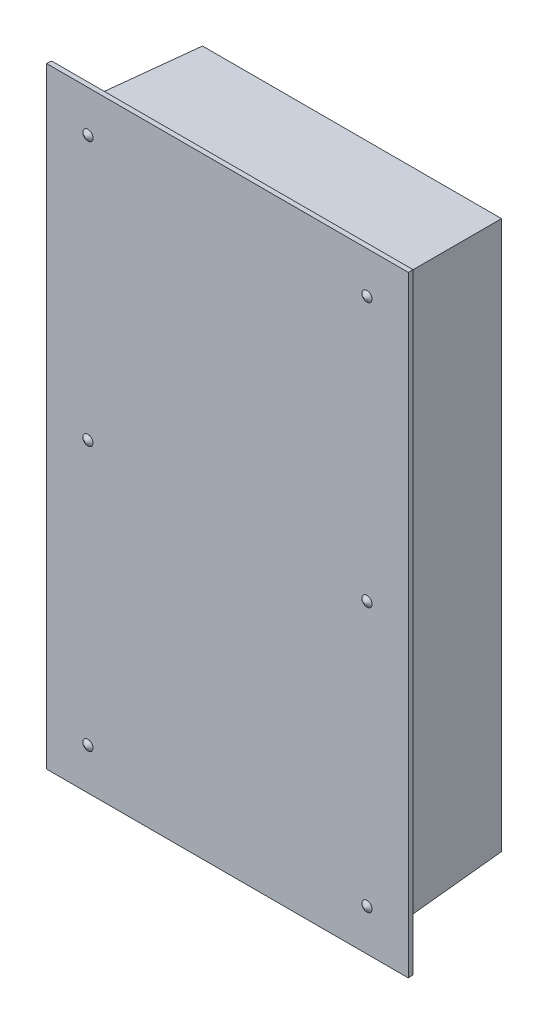
ISO-10303-21;
HEADER;
FILE_DESCRIPTION(('STEP AP214'),'2;1');
FILE_NAME('part.step','',(''),(''),'','','');
FILE_SCHEMA(('AUTOMOTIVE_DESIGN { 1 0 10303 214 1 1 1 1 }'));
ENDSEC;
DATA;
#1=APPLICATION_CONTEXT('core data for automotive mechanical design processes');
#2=APPLICATION_PROTOCOL_DEFINITION('international standard','automotive_design',2000,#1);
#3=PRODUCT_CONTEXT('',#1,'mechanical');
#4=PRODUCT('Part','Part','',(#3));
#5=PRODUCT_RELATED_PRODUCT_CATEGORY('part','',(#4));
#6=PRODUCT_DEFINITION_FORMATION('','',#4);
#7=PRODUCT_DEFINITION_CONTEXT('part definition',#1,'design');
#8=PRODUCT_DEFINITION('design','',#6,#7);
#9=PRODUCT_DEFINITION_SHAPE('','',#8);
#10=(LENGTH_UNIT() NAMED_UNIT(*) SI_UNIT(.MILLI.,.METRE.));
#11=(NAMED_UNIT(*) PLANE_ANGLE_UNIT() SI_UNIT($,.RADIAN.));
#12=(NAMED_UNIT(*) SI_UNIT($,.STERADIAN.) SOLID_ANGLE_UNIT());
#13=UNCERTAINTY_MEASURE_WITH_UNIT(LENGTH_MEASURE(1.E-05),#10,'distance_accuracy_value','');
#14=(GEOMETRIC_REPRESENTATION_CONTEXT(3) GLOBAL_UNCERTAINTY_ASSIGNED_CONTEXT((#13)) GLOBAL_UNIT_ASSIGNED_CONTEXT((#10,
#11,#12)) REPRESENTATION_CONTEXT('',''));
#15=CARTESIAN_POINT('',(0.,0.,0.));
#16=DIRECTION('',(0.,0.,1.));
#17=DIRECTION('',(1.,0.,0.));
#18=AXIS2_PLACEMENT_3D('',#15,#16,#17);
#19=CARTESIAN_POINT('',(0.,0.,0.));
#20=DIRECTION('',(0.,0.,-1.));
#21=DIRECTION('',(-1.,0.,0.));
#22=AXIS2_PLACEMENT_3D('',#19,#20,#21);
#23=PLANE('',#22);
#24=CARTESIAN_POINT('',(56.,106.,0.));
#25=DIRECTION('',(0.,0.,-1.));
#26=DIRECTION('',(-1.,0.,0.));
#27=AXIS2_PLACEMENT_3D('',#24,#25,#26);
#28=CIRCLE('',#27,1.49999999999999);
#29=CARTESIAN_POINT('',(54.5,106.,0.));
#30=VERTEX_POINT('',#29);
#31=EDGE_CURVE('E287',#30,#30,#28,.T.);
#32=ORIENTED_EDGE('',*,*,#31,.F.);
#33=EDGE_LOOP('',(#32));
#34=FACE_BOUND('',#33,.T.);
#35=CARTESIAN_POINT('',(-56.,106.,0.));
#36=DIRECTION('',(0.,0.,-1.));
#37=DIRECTION('',(-1.,0.,0.));
#38=AXIS2_PLACEMENT_3D('',#35,#36,#37);
#39=CIRCLE('',#38,1.49999999999999);
#40=CARTESIAN_POINT('',(-57.5,106.,0.));
#41=VERTEX_POINT('',#40);
#42=EDGE_CURVE('E293',#41,#41,#39,.T.);
#43=ORIENTED_EDGE('',*,*,#42,.F.);
#44=EDGE_LOOP('',(#43));
#45=FACE_BOUND('',#44,.T.);
#46=CARTESIAN_POINT('',(56.,-106.,0.));
#47=DIRECTION('',(0.,0.,-1.));
#48=DIRECTION('',(-1.,0.,0.));
#49=AXIS2_PLACEMENT_3D('',#46,#47,#48);
#50=CIRCLE('',#49,1.49999999999999);
#51=CARTESIAN_POINT('',(54.5,-106.,0.));
#52=VERTEX_POINT('',#51);
#53=EDGE_CURVE('E299',#52,#52,#50,.T.);
#54=ORIENTED_EDGE('',*,*,#53,.F.);
#55=EDGE_LOOP('',(#54));
#56=FACE_BOUND('',#55,.T.);
#57=CARTESIAN_POINT('',(-56.,-106.,0.));
#58=DIRECTION('',(0.,0.,-1.));
#59=DIRECTION('',(-1.,0.,0.));
#60=AXIS2_PLACEMENT_3D('',#57,#58,#59);
#61=CIRCLE('',#60,1.49999999999999);
#62=CARTESIAN_POINT('',(-57.5,-106.,0.));
#63=VERTEX_POINT('',#62);
#64=EDGE_CURVE('E305',#63,#63,#61,.T.);
#65=ORIENTED_EDGE('',*,*,#64,.F.);
#66=EDGE_LOOP('',(#65));
#67=FACE_BOUND('',#66,.T.);
#68=CARTESIAN_POINT('',(56.,0.,0.));
#69=DIRECTION('',(0.,0.,-1.));
#70=DIRECTION('',(-1.,0.,0.));
#71=AXIS2_PLACEMENT_3D('',#68,#69,#70);
#72=CIRCLE('',#71,1.49999999999999);
#73=CARTESIAN_POINT('',(54.5,0.,0.));
#74=VERTEX_POINT('',#73);
#75=EDGE_CURVE('E311',#74,#74,#72,.T.);
#76=ORIENTED_EDGE('',*,*,#75,.F.);
#77=EDGE_LOOP('',(#76));
#78=FACE_BOUND('',#77,.T.);
#79=CARTESIAN_POINT('',(-56.,0.,0.));
#80=DIRECTION('',(0.,0.,-1.));
#81=DIRECTION('',(-1.,0.,0.));
#82=AXIS2_PLACEMENT_3D('',#79,#80,#81);
#83=CIRCLE('',#82,1.49999999999999);
#84=CARTESIAN_POINT('',(-57.5,0.,0.));
#85=VERTEX_POINT('',#84);
#86=EDGE_CURVE('E317',#85,#85,#83,.T.);
#87=ORIENTED_EDGE('',*,*,#86,.F.);
#88=EDGE_LOOP('',(#87));
#89=FACE_BOUND('',#88,.T.);
#90=DIRECTION('',(0.,1.,0.));
#91=VECTOR('',#90,1.);
#92=CARTESIAN_POINT('',(60.,-110.,0.));
#93=LINE('',#92,#91);
#94=CARTESIAN_POINT('',(60.,-110.,0.));
#95=VERTEX_POINT('',#94);
#96=CARTESIAN_POINT('',(60.,110.,0.));
#97=VERTEX_POINT('',#96);
#98=EDGE_CURVE('E336',#95,#97,#93,.T.);
#99=ORIENTED_EDGE('',*,*,#98,.F.);
#100=DIRECTION('',(1.,0.,0.));
#101=VECTOR('',#100,1.);
#102=CARTESIAN_POINT('',(-60.,-110.,0.));
#103=LINE('',#102,#101);
#104=CARTESIAN_POINT('',(-60.,-110.,0.));
#105=VERTEX_POINT('',#104);
#106=EDGE_CURVE('E360',#105,#95,#103,.T.);
#107=ORIENTED_EDGE('',*,*,#106,.F.);
#108=DIRECTION('',(0.,-1.,0.));
#109=VECTOR('',#108,1.);
#110=CARTESIAN_POINT('',(-60.,-110.,0.));
#111=LINE('',#110,#109);
#112=CARTESIAN_POINT('',(-60.,110.,0.));
#113=VERTEX_POINT('',#112);
#114=EDGE_CURVE('E358',#113,#105,#111,.T.);
#115=ORIENTED_EDGE('',*,*,#114,.F.);
#116=DIRECTION('',(-1.,0.,0.));
#117=VECTOR('',#116,1.);
#118=CARTESIAN_POINT('',(-60.,110.,0.));
#119=LINE('',#118,#117);
#120=EDGE_CURVE('E356',#97,#113,#119,.T.);
#121=ORIENTED_EDGE('',*,*,#120,.F.);
#122=EDGE_LOOP('',(#99,#107,#115,#121));
#123=FACE_BOUND('',#122,.T.);
#124=CARTESIAN_POINT('',(-56.,-106.,0.));
#125=DIRECTION('',(0.,0.,-1.));
#126=DIRECTION('',(-1.,0.,0.));
#127=AXIS2_PLACEMENT_3D('',#124,#125,#126);
#128=CIRCLE('',#127,3.49999999999999);
#129=CARTESIAN_POINT('',(-57.9972553080042,-103.125809464449,0.));
#130=VERTEX_POINT('',#129);
#131=CARTESIAN_POINT('',(-53.1258094644493,-107.997255308004,0.));
#132=VERTEX_POINT('',#131);
#133=EDGE_CURVE('E228',#130,#132,#128,.T.);
#134=ORIENTED_EDGE('',*,*,#133,.T.);
#135=DIRECTION('',(-1.,0.,0.));
#136=VECTOR('',#135,1.);
#137=CARTESIAN_POINT('',(0.,-107.997255308004,0.));
#138=LINE('',#137,#136);
#139=CARTESIAN_POINT('',(53.1258094644493,-107.997255308004,0.));
#140=VERTEX_POINT('',#139);
#141=EDGE_CURVE('E558',#132,#140,#138,.F.);
#142=ORIENTED_EDGE('',*,*,#141,.T.);
#143=CARTESIAN_POINT('',(56.,-106.,0.));
#144=DIRECTION('',(0.,0.,-1.));
#145=DIRECTION('',(-1.,0.,0.));
#146=AXIS2_PLACEMENT_3D('',#143,#144,#145);
#147=CIRCLE('',#146,3.49999999999999);
#148=CARTESIAN_POINT('',(57.9972553080041,-103.125809464449,0.));
#149=VERTEX_POINT('',#148);
#150=EDGE_CURVE('E223',#140,#149,#147,.T.);
#151=ORIENTED_EDGE('',*,*,#150,.T.);
#152=DIRECTION('',(0.,-1.,0.));
#153=VECTOR('',#152,1.);
#154=CARTESIAN_POINT('',(57.9972553080041,0.,0.));
#155=LINE('',#154,#153);
#156=CARTESIAN_POINT('',(57.9972553080041,-2.87419053555069,0.));
#157=VERTEX_POINT('',#156);
#158=EDGE_CURVE('E54',#149,#157,#155,.F.);
#159=ORIENTED_EDGE('',*,*,#158,.T.);
#160=CARTESIAN_POINT('',(56.,0.,0.));
#161=DIRECTION('',(0.,0.,-1.));
#162=DIRECTION('',(-1.,0.,0.));
#163=AXIS2_PLACEMENT_3D('',#160,#161,#162);
#164=CIRCLE('',#163,3.49999999999999);
#165=CARTESIAN_POINT('',(57.9972553080041,2.87419053555069,0.));
#166=VERTEX_POINT('',#165);
#167=EDGE_CURVE('E234',#157,#166,#164,.T.);
#168=ORIENTED_EDGE('',*,*,#167,.T.);
#169=CARTESIAN_POINT('',(57.9972553080041,103.125809464449,0.));
#170=VERTEX_POINT('',#169);
#171=EDGE_CURVE('E551',#166,#170,#155,.F.);
#172=ORIENTED_EDGE('',*,*,#171,.T.);
#173=CARTESIAN_POINT('',(56.,106.,0.));
#174=DIRECTION('',(0.,0.,-1.));
#175=DIRECTION('',(-1.,0.,0.));
#176=AXIS2_PLACEMENT_3D('',#173,#174,#175);
#177=CIRCLE('',#176,3.49999999999999);
#178=CARTESIAN_POINT('',(53.1258094644493,107.997255308004,0.));
#179=VERTEX_POINT('',#178);
#180=EDGE_CURVE('E211',#170,#179,#177,.T.);
#181=ORIENTED_EDGE('',*,*,#180,.T.);
#182=DIRECTION('',(1.,0.,0.));
#183=VECTOR('',#182,1.);
#184=CARTESIAN_POINT('',(0.,107.997255308004,0.));
#185=LINE('',#184,#183);
#186=CARTESIAN_POINT('',(-53.1258094644493,107.997255308004,0.));
#187=VERTEX_POINT('',#186);
#188=EDGE_CURVE('E219',#179,#187,#185,.F.);
#189=ORIENTED_EDGE('',*,*,#188,.T.);
#190=CARTESIAN_POINT('',(-56.,106.,0.));
#191=DIRECTION('',(0.,0.,-1.));
#192=DIRECTION('',(-1.,0.,0.));
#193=AXIS2_PLACEMENT_3D('',#190,#191,#192);
#194=CIRCLE('',#193,3.49999999999999);
#195=CARTESIAN_POINT('',(-57.9972553080042,103.125809464449,0.));
#196=VERTEX_POINT('',#195);
#197=EDGE_CURVE('E210',#187,#196,#194,.T.);
#198=ORIENTED_EDGE('',*,*,#197,.T.);
#199=DIRECTION('',(0.,1.,0.));
#200=VECTOR('',#199,1.);
#201=CARTESIAN_POINT('',(-57.9972553080042,0.,0.));
#202=LINE('',#201,#200);
#203=CARTESIAN_POINT('',(-57.9972553080042,2.87419053555069,0.));
#204=VERTEX_POINT('',#203);
#205=EDGE_CURVE('E550',#196,#204,#202,.F.);
#206=ORIENTED_EDGE('',*,*,#205,.T.);
#207=CARTESIAN_POINT('',(-56.,0.,0.));
#208=DIRECTION('',(0.,0.,-1.));
#209=DIRECTION('',(-1.,0.,0.));
#210=AXIS2_PLACEMENT_3D('',#207,#208,#209);
#211=CIRCLE('',#210,3.49999999999999);
#212=CARTESIAN_POINT('',(-57.9972553080042,-2.87419053555069,0.));
#213=VERTEX_POINT('',#212);
#214=EDGE_CURVE('E240',#204,#213,#211,.T.);
#215=ORIENTED_EDGE('',*,*,#214,.T.);
#216=EDGE_CURVE('E561',#213,#130,#202,.F.);
#217=ORIENTED_EDGE('',*,*,#216,.T.);
#218=EDGE_LOOP('',(#134,#142,#151,#159,#168,#172,#181,#189,#198,#206,#215,#217));
#219=FACE_BOUND('',#218,.T.);
#220=ADVANCED_FACE('F37',(#34,#45,#56,#67,#78,#89,#123,#219),#23,.T.);
#221=CARTESIAN_POINT('',(60.,-110.,0.));
#222=DIRECTION('',(0.998629534754574,0.,-0.0523359562429439));
#223=DIRECTION('',(-0.0523359562429439,0.,-0.998629534754574));
#224=AXIS2_PLACEMENT_3D('',#221,#222,#223);
#225=PLANE('',#224);
#226=ORIENTED_EDGE('',*,*,#98,.T.);
#227=DIRECTION('',(-0.052264427688714,-0.052264427688714,-0.997264688634237));
#228=VECTOR('',#227,1.);
#229=CARTESIAN_POINT('',(59.6722115518045,109.672211551805,-6.25457618467583));
#230=LINE('',#229,#228);
#231=CARTESIAN_POINT('',(62.515573405586,112.515573405586,48.));
#232=VERTEX_POINT('',#231);
#233=EDGE_CURVE('E11',#232,#97,#230,.T.);
#234=ORIENTED_EDGE('',*,*,#233,.F.);
#235=DIRECTION('',(0.,-1.,0.));
#236=VECTOR('',#235,1.);
#237=CARTESIAN_POINT('',(62.5155734055859,0.,48.));
#238=LINE('',#237,#236);
#239=CARTESIAN_POINT('',(62.515573405586,-112.515573405586,48.));
#240=VERTEX_POINT('',#239);
#241=EDGE_CURVE('E361',#240,#232,#238,.F.);
#242=ORIENTED_EDGE('',*,*,#241,.F.);
#243=DIRECTION('',(-0.052264427688714,0.052264427688714,-0.997264688634237));
#244=VECTOR('',#243,1.);
#245=CARTESIAN_POINT('',(60.,-110.,0.));
#246=LINE('',#245,#244);
#247=EDGE_CURVE('E363',#240,#95,#246,.T.);
#248=ORIENTED_EDGE('',*,*,#247,.T.);
#249=EDGE_LOOP('',(#226,#234,#242,#248));
#250=FACE_BOUND('',#249,.T.);
#251=ADVANCED_FACE('F384',(#250),#225,.T.);
#252=CARTESIAN_POINT('',(-60.,110.,0.));
#253=DIRECTION('',(0.,0.998629534754574,-0.0523359562429439));
#254=DIRECTION('',(0.,0.0523359562429439,0.998629534754574));
#255=AXIS2_PLACEMENT_3D('',#252,#253,#254);
#256=PLANE('',#255);
#257=ORIENTED_EDGE('',*,*,#120,.T.);
#258=DIRECTION('',(0.052264427688714,-0.052264427688714,-0.997264688634237));
#259=VECTOR('',#258,1.);
#260=CARTESIAN_POINT('',(-59.3990545116417,109.399054511642,-11.466723005239));
#261=LINE('',#260,#259);
#262=CARTESIAN_POINT('',(-62.515573405586,112.515573405586,48.));
#263=VERTEX_POINT('',#262);
#264=EDGE_CURVE('E46',#263,#113,#261,.T.);
#265=ORIENTED_EDGE('',*,*,#264,.F.);
#266=DIRECTION('',(1.,0.,0.));
#267=VECTOR('',#266,1.);
#268=CARTESIAN_POINT('',(0.,112.515573405586,48.));
#269=LINE('',#268,#267);
#270=EDGE_CURVE('E371',#232,#263,#269,.F.);
#271=ORIENTED_EDGE('',*,*,#270,.F.);
#272=ORIENTED_EDGE('',*,*,#233,.T.);
#273=EDGE_LOOP('',(#257,#265,#271,#272));
#274=FACE_BOUND('',#273,.T.);
#275=ADVANCED_FACE('F39',(#274),#256,.T.);
#276=CARTESIAN_POINT('',(-60.,-110.,0.));
#277=DIRECTION('',(-0.998629534754574,0.,-0.0523359562429439));
#278=DIRECTION('',(-0.0523359562429439,0.,0.998629534754574));
#279=AXIS2_PLACEMENT_3D('',#276,#277,#278);
#280=PLANE('',#279);
#281=ORIENTED_EDGE('',*,*,#114,.T.);
#282=DIRECTION('',(0.052264427688714,0.052264427688714,-0.997264688634237));
#283=VECTOR('',#282,1.);
#284=CARTESIAN_POINT('',(-60.,-110.,0.));
#285=LINE('',#284,#283);
#286=CARTESIAN_POINT('',(-62.515573405586,-112.515573405586,48.));
#287=VERTEX_POINT('',#286);
#288=EDGE_CURVE('E62',#287,#105,#285,.T.);
#289=ORIENTED_EDGE('',*,*,#288,.F.);
#290=DIRECTION('',(0.,1.,0.));
#291=VECTOR('',#290,1.);
#292=CARTESIAN_POINT('',(-62.515573405586,0.,48.));
#293=LINE('',#292,#291);
#294=EDGE_CURVE('E373',#263,#287,#293,.F.);
#295=ORIENTED_EDGE('',*,*,#294,.F.);
#296=ORIENTED_EDGE('',*,*,#264,.T.);
#297=EDGE_LOOP('',(#281,#289,#295,#296));
#298=FACE_BOUND('',#297,.T.);
#299=ADVANCED_FACE('F390',(#298),#280,.T.);
#300=CARTESIAN_POINT('',(-60.,-110.,0.));
#301=DIRECTION('',(0.,-0.998629534754574,-0.0523359562429439));
#302=DIRECTION('',(0.,0.0523359562429439,-0.998629534754574));
#303=AXIS2_PLACEMENT_3D('',#300,#301,#302);
#304=PLANE('',#303);
#305=ORIENTED_EDGE('',*,*,#106,.T.);
#306=ORIENTED_EDGE('',*,*,#247,.F.);
#307=DIRECTION('',(-1.,0.,0.));
#308=VECTOR('',#307,1.);
#309=CARTESIAN_POINT('',(0.,-112.515573405586,48.));
#310=LINE('',#309,#308);
#311=EDGE_CURVE('E41',#287,#240,#310,.F.);
#312=ORIENTED_EDGE('',*,*,#311,.F.);
#313=ORIENTED_EDGE('',*,*,#288,.T.);
#314=EDGE_LOOP('',(#305,#306,#312,#313));
#315=FACE_BOUND('',#314,.T.);
#316=ADVANCED_FACE('F380',(#315),#304,.T.);
#317=CARTESIAN_POINT('',(0.,0.,48.));
#318=DIRECTION('',(0.,0.,1.));
#319=DIRECTION('',(1.,0.,0.));
#320=AXIS2_PLACEMENT_3D('',#317,#318,#319);
#321=PLANE('',#320);
#322=DIRECTION('',(0.,1.,0.));
#323=VECTOR('',#322,1.);
#324=CARTESIAN_POINT('',(72.515573405586,122.515573405586,48.));
#325=LINE('',#324,#323);
#326=CARTESIAN_POINT('',(72.515573405586,-122.515573405586,48.));
#327=VERTEX_POINT('',#326);
#328=CARTESIAN_POINT('',(72.515573405586,122.515573405586,48.));
#329=VERTEX_POINT('',#328);
#330=EDGE_CURVE('E323',#327,#329,#325,.T.);
#331=ORIENTED_EDGE('',*,*,#330,.F.);
#332=DIRECTION('',(1.,0.,0.));
#333=VECTOR('',#332,1.);
#334=CARTESIAN_POINT('',(-72.5155734055859,-122.515573405586,48.));
#335=LINE('',#334,#333);
#336=CARTESIAN_POINT('',(-72.5155734055859,-122.515573405586,48.));
#337=VERTEX_POINT('',#336);
#338=EDGE_CURVE('E330',#337,#327,#335,.T.);
#339=ORIENTED_EDGE('',*,*,#338,.F.);
#340=DIRECTION('',(0.,-1.,0.));
#341=VECTOR('',#340,1.);
#342=CARTESIAN_POINT('',(-72.5155734055859,122.515573405586,48.));
#343=LINE('',#342,#341);
#344=CARTESIAN_POINT('',(-72.5155734055859,122.515573405586,48.));
#345=VERTEX_POINT('',#344);
#346=EDGE_CURVE('E328',#345,#337,#343,.T.);
#347=ORIENTED_EDGE('',*,*,#346,.F.);
#348=DIRECTION('',(-1.,0.,0.));
#349=VECTOR('',#348,1.);
#350=CARTESIAN_POINT('',(-72.5155734055859,122.515573405586,48.));
#351=LINE('',#350,#349);
#352=EDGE_CURVE('E326',#329,#345,#351,.T.);
#353=ORIENTED_EDGE('',*,*,#352,.F.);
#354=EDGE_LOOP('',(#331,#339,#347,#353));
#355=FACE_BOUND('',#354,.T.);
#356=ORIENTED_EDGE('',*,*,#311,.T.);
#357=ORIENTED_EDGE('',*,*,#241,.T.);
#358=ORIENTED_EDGE('',*,*,#270,.T.);
#359=ORIENTED_EDGE('',*,*,#294,.T.);
#360=EDGE_LOOP('',(#356,#357,#358,#359));
#361=FACE_BOUND('',#360,.T.);
#362=ADVANCED_FACE('F377',(#355,#361),#321,.F.);
#363=CARTESIAN_POINT('',(72.515573405586,122.515573405586,48.));
#364=DIRECTION('',(0.998629534754574,0.,-0.0523359562429439));
#365=DIRECTION('',(-0.0523359562429439,0.,-0.998629534754574));
#366=AXIS2_PLACEMENT_3D('',#363,#364,#365);
#367=PLANE('',#366);
#368=ORIENTED_EDGE('',*,*,#330,.T.);
#369=DIRECTION('',(-0.052264427688714,-0.052264427688714,-0.997264688634237));
#370=VECTOR('',#369,1.);
#371=CARTESIAN_POINT('',(72.1194106176423,122.119410617642,40.4407636926552));
#372=LINE('',#371,#370);
#373=CARTESIAN_POINT('',(72.620388964152,122.620388964152,50.));
#374=VERTEX_POINT('',#373);
#375=EDGE_CURVE('E333',#374,#329,#372,.T.);
#376=ORIENTED_EDGE('',*,*,#375,.F.);
#377=DIRECTION('',(0.,-1.,0.));
#378=VECTOR('',#377,1.);
#379=CARTESIAN_POINT('',(72.620388964152,122.515573405586,50.));
#380=LINE('',#379,#378);
#381=CARTESIAN_POINT('',(72.620388964152,-122.620388964152,50.));
#382=VERTEX_POINT('',#381);
#383=EDGE_CURVE('E332',#382,#374,#380,.F.);
#384=ORIENTED_EDGE('',*,*,#383,.F.);
#385=DIRECTION('',(-0.052264427688714,0.052264427688714,-0.997264688634237));
#386=VECTOR('',#385,1.);
#387=CARTESIAN_POINT('',(71.8462535774794,-121.846253577479,35.228616872092));
#388=LINE('',#387,#386);
#389=EDGE_CURVE('E338',#382,#327,#388,.T.);
#390=ORIENTED_EDGE('',*,*,#389,.T.);
#391=EDGE_LOOP('',(#368,#376,#384,#390));
#392=FACE_BOUND('',#391,.T.);
#393=ADVANCED_FACE('F411',(#392),#367,.T.);
#394=CARTESIAN_POINT('',(-72.5155734055859,122.515573405586,48.));
#395=DIRECTION('',(0.,0.998629534754574,-0.0523359562429439));
#396=DIRECTION('',(0.,0.0523359562429439,0.998629534754574));
#397=AXIS2_PLACEMENT_3D('',#394,#395,#396);
#398=PLANE('',#397);
#399=ORIENTED_EDGE('',*,*,#352,.T.);
#400=DIRECTION('',(0.052264427688714,-0.052264427688714,-0.997264688634237));
#401=VECTOR('',#400,1.);
#402=CARTESIAN_POINT('',(-72.5155734055859,122.515573405586,48.));
#403=LINE('',#402,#401);
#404=CARTESIAN_POINT('',(-72.620388964152,122.620388964152,50.));
#405=VERTEX_POINT('',#404);
#406=EDGE_CURVE('E337',#405,#345,#403,.T.);
#407=ORIENTED_EDGE('',*,*,#406,.F.);
#408=DIRECTION('',(1.,0.,0.));
#409=VECTOR('',#408,1.);
#410=CARTESIAN_POINT('',(-72.5155734055859,122.620388964152,50.));
#411=LINE('',#410,#409);
#412=EDGE_CURVE('E349',#374,#405,#411,.F.);
#413=ORIENTED_EDGE('',*,*,#412,.F.);
#414=ORIENTED_EDGE('',*,*,#375,.T.);
#415=EDGE_LOOP('',(#399,#407,#413,#414));
#416=FACE_BOUND('',#415,.T.);
#417=ADVANCED_FACE('F407',(#416),#398,.T.);
#418=CARTESIAN_POINT('',(-72.5155734055859,122.515573405586,48.));
#419=DIRECTION('',(-0.998629534754574,0.,-0.0523359562429439));
#420=DIRECTION('',(-0.0523359562429439,0.,0.998629534754574));
#421=AXIS2_PLACEMENT_3D('',#418,#419,#420);
#422=PLANE('',#421);
#423=ORIENTED_EDGE('',*,*,#346,.T.);
#424=DIRECTION('',(0.052264427688714,0.052264427688714,-0.997264688634237));
#425=VECTOR('',#424,1.);
#426=CARTESIAN_POINT('',(-72.5155734055859,-122.515573405586,48.));
#427=LINE('',#426,#425);
#428=CARTESIAN_POINT('',(-72.620388964152,-122.620388964152,50.));
#429=VERTEX_POINT('',#428);
#430=EDGE_CURVE('E341',#429,#337,#427,.T.);
#431=ORIENTED_EDGE('',*,*,#430,.F.);
#432=DIRECTION('',(0.,1.,0.));
#433=VECTOR('',#432,1.);
#434=CARTESIAN_POINT('',(-72.620388964152,122.515573405586,50.));
#435=LINE('',#434,#433);
#436=EDGE_CURVE('E351',#405,#429,#435,.F.);
#437=ORIENTED_EDGE('',*,*,#436,.F.);
#438=ORIENTED_EDGE('',*,*,#406,.T.);
#439=EDGE_LOOP('',(#423,#431,#437,#438));
#440=FACE_BOUND('',#439,.T.);
#441=ADVANCED_FACE('F410',(#440),#422,.T.);
#442=CARTESIAN_POINT('',(-72.5155734055859,-122.515573405586,48.));
#443=DIRECTION('',(0.,-0.998629534754574,-0.0523359562429439));
#444=DIRECTION('',(0.,0.0523359562429439,-0.998629534754574));
#445=AXIS2_PLACEMENT_3D('',#442,#443,#444);
#446=PLANE('',#445);
#447=ORIENTED_EDGE('',*,*,#338,.T.);
#448=ORIENTED_EDGE('',*,*,#389,.F.);
#449=DIRECTION('',(-1.,0.,0.));
#450=VECTOR('',#449,1.);
#451=CARTESIAN_POINT('',(-72.5155734055859,-122.620388964152,50.));
#452=LINE('',#451,#450);
#453=EDGE_CURVE('E342',#429,#382,#452,.F.);
#454=ORIENTED_EDGE('',*,*,#453,.F.);
#455=ORIENTED_EDGE('',*,*,#430,.T.);
#456=EDGE_LOOP('',(#447,#448,#454,#455));
#457=FACE_BOUND('',#456,.T.);
#458=ADVANCED_FACE('F415',(#457),#446,.T.);
#459=CARTESIAN_POINT('',(0.,0.,50.));
#460=DIRECTION('',(0.,0.,1.));
#461=DIRECTION('',(1.,0.,0.));
#462=AXIS2_PLACEMENT_3D('',#459,#460,#461);
#463=PLANE('',#462);
#464=ORIENTED_EDGE('',*,*,#383,.T.);
#465=ORIENTED_EDGE('',*,*,#412,.T.);
#466=ORIENTED_EDGE('',*,*,#436,.T.);
#467=ORIENTED_EDGE('',*,*,#453,.T.);
#468=EDGE_LOOP('',(#464,#465,#466,#467));
#469=FACE_BOUND('',#468,.T.);
#470=ADVANCED_FACE('F419',(#469),#463,.T.);
#471=CARTESIAN_POINT('',(-56.,0.,48.));
#472=DIRECTION('',(0.,0.,-1.));
#473=DIRECTION('',(-1.,0.,0.));
#474=AXIS2_PLACEMENT_3D('',#471,#472,#473);
#475=CONICAL_SURFACE('',#474,1.49999999999999,1.02974425867665);
#476=CARTESIAN_POINT('',(-56.,0.,48.9012909285413));
#477=VERTEX_POINT('',#476);
#478=VERTEX_LOOP('',#477);
#479=FACE_BOUND('',#478,.T.);
#480=CARTESIAN_POINT('',(-56.,0.,48.));
#481=DIRECTION('',(0.,0.,-1.));
#482=DIRECTION('',(-1.,0.,0.));
#483=AXIS2_PLACEMENT_3D('',#480,#481,#482);
#484=CIRCLE('',#483,1.49999999999999);
#485=CARTESIAN_POINT('',(-57.5,0.,48.));
#486=VERTEX_POINT('',#485);
#487=EDGE_CURVE('E320',#486,#486,#484,.T.);
#488=ORIENTED_EDGE('',*,*,#487,.T.);
#489=EDGE_LOOP('',(#488));
#490=FACE_BOUND('',#489,.T.);
#491=ADVANCED_FACE('F429',(#479,#490),#475,.F.);
#492=CARTESIAN_POINT('',(-56.,0.,0.));
#493=DIRECTION('',(0.,0.,-1.));
#494=DIRECTION('',(-1.,0.,0.));
#495=AXIS2_PLACEMENT_3D('',#492,#493,#494);
#496=CYLINDRICAL_SURFACE('',#495,1.49999999999999);
#497=ORIENTED_EDGE('',*,*,#487,.F.);
#498=EDGE_LOOP('',(#497));
#499=FACE_BOUND('',#498,.T.);
#500=ORIENTED_EDGE('',*,*,#86,.T.);
#501=EDGE_LOOP('',(#500));
#502=FACE_BOUND('',#501,.T.);
#503=ADVANCED_FACE('F433',(#499,#502),#496,.F.);
#504=CARTESIAN_POINT('',(56.,0.,48.));
#505=DIRECTION('',(0.,0.,-1.));
#506=DIRECTION('',(-1.,0.,0.));
#507=AXIS2_PLACEMENT_3D('',#504,#505,#506);
#508=CONICAL_SURFACE('',#507,1.49999999999999,1.02974425867665);
#509=CARTESIAN_POINT('',(56.,0.,48.9012909285413));
#510=VERTEX_POINT('',#509);
#511=VERTEX_LOOP('',#510);
#512=FACE_BOUND('',#511,.T.);
#513=CARTESIAN_POINT('',(56.,0.,48.));
#514=DIRECTION('',(0.,0.,-1.));
#515=DIRECTION('',(-1.,0.,0.));
#516=AXIS2_PLACEMENT_3D('',#513,#514,#515);
#517=CIRCLE('',#516,1.49999999999999);
#518=CARTESIAN_POINT('',(54.5,0.,48.));
#519=VERTEX_POINT('',#518);
#520=EDGE_CURVE('E314',#519,#519,#517,.T.);
#521=ORIENTED_EDGE('',*,*,#520,.T.);
#522=EDGE_LOOP('',(#521));
#523=FACE_BOUND('',#522,.T.);
#524=ADVANCED_FACE('F437',(#512,#523),#508,.F.);
#525=CARTESIAN_POINT('',(56.,0.,0.));
#526=DIRECTION('',(0.,0.,-1.));
#527=DIRECTION('',(-1.,0.,0.));
#528=AXIS2_PLACEMENT_3D('',#525,#526,#527);
#529=CYLINDRICAL_SURFACE('',#528,1.49999999999999);
#530=ORIENTED_EDGE('',*,*,#520,.F.);
#531=EDGE_LOOP('',(#530));
#532=FACE_BOUND('',#531,.T.);
#533=ORIENTED_EDGE('',*,*,#75,.T.);
#534=EDGE_LOOP('',(#533));
#535=FACE_BOUND('',#534,.T.);
#536=ADVANCED_FACE('F441',(#532,#535),#529,.F.);
#537=CARTESIAN_POINT('',(-56.,-106.,48.));
#538=DIRECTION('',(0.,0.,-1.));
#539=DIRECTION('',(-1.,0.,0.));
#540=AXIS2_PLACEMENT_3D('',#537,#538,#539);
#541=CONICAL_SURFACE('',#540,1.49999999999999,1.02974425867665);
#542=CARTESIAN_POINT('',(-56.,-106.,48.9012909285413));
#543=VERTEX_POINT('',#542);
#544=VERTEX_LOOP('',#543);
#545=FACE_BOUND('',#544,.T.);
#546=CARTESIAN_POINT('',(-56.,-106.,48.));
#547=DIRECTION('',(0.,0.,-1.));
#548=DIRECTION('',(-1.,0.,0.));
#549=AXIS2_PLACEMENT_3D('',#546,#547,#548);
#550=CIRCLE('',#549,1.49999999999999);
#551=CARTESIAN_POINT('',(-57.5,-106.,48.));
#552=VERTEX_POINT('',#551);
#553=EDGE_CURVE('E308',#552,#552,#550,.T.);
#554=ORIENTED_EDGE('',*,*,#553,.T.);
#555=EDGE_LOOP('',(#554));
#556=FACE_BOUND('',#555,.T.);
#557=ADVANCED_FACE('F445',(#545,#556),#541,.F.);
#558=CARTESIAN_POINT('',(-56.,-106.,0.));
#559=DIRECTION('',(0.,0.,-1.));
#560=DIRECTION('',(-1.,0.,0.));
#561=AXIS2_PLACEMENT_3D('',#558,#559,#560);
#562=CYLINDRICAL_SURFACE('',#561,1.49999999999999);
#563=ORIENTED_EDGE('',*,*,#553,.F.);
#564=EDGE_LOOP('',(#563));
#565=FACE_BOUND('',#564,.T.);
#566=ORIENTED_EDGE('',*,*,#64,.T.);
#567=EDGE_LOOP('',(#566));
#568=FACE_BOUND('',#567,.T.);
#569=ADVANCED_FACE('F449',(#565,#568),#562,.F.);
#570=CARTESIAN_POINT('',(56.,-106.,48.));
#571=DIRECTION('',(0.,0.,-1.));
#572=DIRECTION('',(-1.,0.,0.));
#573=AXIS2_PLACEMENT_3D('',#570,#571,#572);
#574=CONICAL_SURFACE('',#573,1.49999999999999,1.02974425867665);
#575=CARTESIAN_POINT('',(56.,-106.,48.9012909285413));
#576=VERTEX_POINT('',#575);
#577=VERTEX_LOOP('',#576);
#578=FACE_BOUND('',#577,.T.);
#579=CARTESIAN_POINT('',(56.,-106.,48.));
#580=DIRECTION('',(0.,0.,-1.));
#581=DIRECTION('',(-1.,0.,0.));
#582=AXIS2_PLACEMENT_3D('',#579,#580,#581);
#583=CIRCLE('',#582,1.49999999999999);
#584=CARTESIAN_POINT('',(54.5,-106.,48.));
#585=VERTEX_POINT('',#584);
#586=EDGE_CURVE('E302',#585,#585,#583,.T.);
#587=ORIENTED_EDGE('',*,*,#586,.T.);
#588=EDGE_LOOP('',(#587));
#589=FACE_BOUND('',#588,.T.);
#590=ADVANCED_FACE('F453',(#578,#589),#574,.F.);
#591=CARTESIAN_POINT('',(56.,-106.,0.));
#592=DIRECTION('',(0.,0.,-1.));
#593=DIRECTION('',(-1.,0.,0.));
#594=AXIS2_PLACEMENT_3D('',#591,#592,#593);
#595=CYLINDRICAL_SURFACE('',#594,1.49999999999999);
#596=ORIENTED_EDGE('',*,*,#586,.F.);
#597=EDGE_LOOP('',(#596));
#598=FACE_BOUND('',#597,.T.);
#599=ORIENTED_EDGE('',*,*,#53,.T.);
#600=EDGE_LOOP('',(#599));
#601=FACE_BOUND('',#600,.T.);
#602=ADVANCED_FACE('F457',(#598,#601),#595,.F.);
#603=CARTESIAN_POINT('',(-56.,106.,48.));
#604=DIRECTION('',(0.,0.,-1.));
#605=DIRECTION('',(-1.,0.,0.));
#606=AXIS2_PLACEMENT_3D('',#603,#604,#605);
#607=CONICAL_SURFACE('',#606,1.49999999999999,1.02974425867665);
#608=CARTESIAN_POINT('',(-56.,106.,48.9012909285413));
#609=VERTEX_POINT('',#608);
#610=VERTEX_LOOP('',#609);
#611=FACE_BOUND('',#610,.T.);
#612=CARTESIAN_POINT('',(-56.,106.,48.));
#613=DIRECTION('',(0.,0.,-1.));
#614=DIRECTION('',(-1.,0.,0.));
#615=AXIS2_PLACEMENT_3D('',#612,#613,#614);
#616=CIRCLE('',#615,1.49999999999999);
#617=CARTESIAN_POINT('',(-57.5,106.,48.));
#618=VERTEX_POINT('',#617);
#619=EDGE_CURVE('E296',#618,#618,#616,.T.);
#620=ORIENTED_EDGE('',*,*,#619,.T.);
#621=EDGE_LOOP('',(#620));
#622=FACE_BOUND('',#621,.T.);
#623=ADVANCED_FACE('F461',(#611,#622),#607,.F.);
#624=CARTESIAN_POINT('',(-56.,106.,0.));
#625=DIRECTION('',(0.,0.,-1.));
#626=DIRECTION('',(-1.,0.,0.));
#627=AXIS2_PLACEMENT_3D('',#624,#625,#626);
#628=CYLINDRICAL_SURFACE('',#627,1.49999999999999);
#629=ORIENTED_EDGE('',*,*,#619,.F.);
#630=EDGE_LOOP('',(#629));
#631=FACE_BOUND('',#630,.T.);
#632=ORIENTED_EDGE('',*,*,#42,.T.);
#633=EDGE_LOOP('',(#632));
#634=FACE_BOUND('',#633,.T.);
#635=ADVANCED_FACE('F465',(#631,#634),#628,.F.);
#636=CARTESIAN_POINT('',(56.,106.,48.));
#637=DIRECTION('',(0.,0.,-1.));
#638=DIRECTION('',(-1.,0.,0.));
#639=AXIS2_PLACEMENT_3D('',#636,#637,#638);
#640=CONICAL_SURFACE('',#639,1.49999999999999,1.02974425867665);
#641=CARTESIAN_POINT('',(56.,106.,48.9012909285413));
#642=VERTEX_POINT('',#641);
#643=VERTEX_LOOP('',#642);
#644=FACE_BOUND('',#643,.T.);
#645=CARTESIAN_POINT('',(56.,106.,48.));
#646=DIRECTION('',(0.,0.,-1.));
#647=DIRECTION('',(-1.,0.,0.));
#648=AXIS2_PLACEMENT_3D('',#645,#646,#647);
#649=CIRCLE('',#648,1.49999999999999);
#650=CARTESIAN_POINT('',(54.5,106.,48.));
#651=VERTEX_POINT('',#650);
#652=EDGE_CURVE('E290',#651,#651,#649,.T.);
#653=ORIENTED_EDGE('',*,*,#652,.T.);
#654=EDGE_LOOP('',(#653));
#655=FACE_BOUND('',#654,.T.);
#656=ADVANCED_FACE('F469',(#644,#655),#640,.F.);
#657=CARTESIAN_POINT('',(56.,106.,0.));
#658=DIRECTION('',(0.,0.,-1.));
#659=DIRECTION('',(-1.,0.,0.));
#660=AXIS2_PLACEMENT_3D('',#657,#658,#659);
#661=CYLINDRICAL_SURFACE('',#660,1.49999999999999);
#662=ORIENTED_EDGE('',*,*,#652,.F.);
#663=EDGE_LOOP('',(#662));
#664=FACE_BOUND('',#663,.T.);
#665=ORIENTED_EDGE('',*,*,#31,.T.);
#666=EDGE_LOOP('',(#665));
#667=FACE_BOUND('',#666,.T.);
#668=ADVANCED_FACE('F473',(#664,#667),#661,.F.);
#669=CARTESIAN_POINT('',(-58.0027409304909,-110.,0.104671912485888));
#670=DIRECTION('',(-0.998629534754574,0.,-0.0523359562429439));
#671=DIRECTION('',(-0.0523359562429439,0.,0.998629534754574));
#672=AXIS2_PLACEMENT_3D('',#669,#670,#671);
#673=PLANE('',#672);
#674=DIRECTION('',(0.052264427688714,0.052264427688714,-0.997264688634237));
#675=VECTOR('',#674,1.);
#676=CARTESIAN_POINT('',(-58.0081965842495,-108.00819658425,0.208771987575719));
#677=LINE('',#676,#675);
#678=CARTESIAN_POINT('',(-60.5128287135901,-110.51282871359,48.));
#679=VERTEX_POINT('',#678);
#680=CARTESIAN_POINT('',(-58.4748737341529,-108.474873734153,9.11350247392195));
#681=VERTEX_POINT('',#680);
#682=EDGE_CURVE('E556',#679,#681,#677,.T.);
#683=ORIENTED_EDGE('',*,*,#682,.T.);
#684=CARTESIAN_POINT('',(-56.,-106.,-38.1099015323179));
#685=DIRECTION('',(-0.998629534754574,0.,-0.0523359562429439));
#686=DIRECTION('',(0.0523359562429439,0.,-0.998629534754574));
#687=AXIS2_PLACEMENT_3D('',#684,#685,#686);
#688=ELLIPSE('',#687,66.8756291325406,3.49999999999999);
#689=EDGE_CURVE('E256',#130,#681,#688,.F.);
#690=ORIENTED_EDGE('',*,*,#689,.F.);
#691=ORIENTED_EDGE('',*,*,#216,.F.);
#692=CARTESIAN_POINT('',(-56.,0.,-38.1099015323179));
#693=DIRECTION('',(-0.998629534754574,0.,-0.0523359562429439));
#694=DIRECTION('',(0.0523359562429439,0.,-0.998629534754574));
#695=AXIS2_PLACEMENT_3D('',#692,#693,#694);
#696=ELLIPSE('',#695,66.8756291325406,3.49999999999999);
#697=EDGE_CURVE('E248',#204,#213,#696,.F.);
#698=ORIENTED_EDGE('',*,*,#697,.F.);
#699=ORIENTED_EDGE('',*,*,#205,.F.);
#700=CARTESIAN_POINT('',(-56.,106.,-38.1099015323179));
#701=DIRECTION('',(-0.998629534754574,0.,-0.0523359562429439));
#702=DIRECTION('',(0.0523359562429439,0.,-0.998629534754574));
#703=AXIS2_PLACEMENT_3D('',#700,#701,#702);
#704=ELLIPSE('',#703,66.8756291325406,3.49999999999999);
#705=CARTESIAN_POINT('',(-58.4748737341529,108.474873734153,9.11350247392213));
#706=VERTEX_POINT('',#705);
#707=EDGE_CURVE('E264',#196,#706,#704,.T.);
#708=ORIENTED_EDGE('',*,*,#707,.T.);
#709=DIRECTION('',(0.052264427688714,-0.052264427688714,-0.997264688634237));
#710=VECTOR('',#709,1.);
#711=CARTESIAN_POINT('',(-57.4072510958912,107.407251095891,-11.2579510176633));
#712=LINE('',#711,#710);
#713=CARTESIAN_POINT('',(-60.5128287135901,110.51282871359,48.));
#714=VERTEX_POINT('',#713);
#715=EDGE_CURVE('E543',#714,#706,#712,.T.);
#716=ORIENTED_EDGE('',*,*,#715,.F.);
#717=DIRECTION('',(0.,-1.,0.));
#718=VECTOR('',#717,1.);
#719=CARTESIAN_POINT('',(-60.5128287135901,0.,48.));
#720=LINE('',#719,#718);
#721=EDGE_CURVE('E284',#679,#714,#720,.F.);
#722=ORIENTED_EDGE('',*,*,#721,.F.);
#723=EDGE_LOOP('',(#683,#690,#691,#698,#699,#708,#716,#722));
#724=FACE_BOUND('',#723,.T.);
#725=ADVANCED_FACE('F477',(#724),#673,.F.);
#726=CARTESIAN_POINT('',(-60.,108.002740930491,0.104671912485888));
#727=DIRECTION('',(0.,0.998629534754574,-0.0523359562429439));
#728=DIRECTION('',(0.,0.0523359562429439,0.998629534754574));
#729=AXIS2_PLACEMENT_3D('',#726,#727,#728);
#730=PLANE('',#729);
#731=ORIENTED_EDGE('',*,*,#715,.T.);
#732=CARTESIAN_POINT('',(-56.,106.,-38.109901532318));
#733=DIRECTION('',(0.,0.998629534754574,-0.0523359562429439));
#734=DIRECTION('',(0.,-0.0523359562429439,-0.998629534754574));
#735=AXIS2_PLACEMENT_3D('',#732,#733,#734);
#736=ELLIPSE('',#735,66.8756291325406,3.49999999999999);
#737=EDGE_CURVE('E267',#187,#706,#736,.F.);
#738=ORIENTED_EDGE('',*,*,#737,.F.);
#739=ORIENTED_EDGE('',*,*,#188,.F.);
#740=CARTESIAN_POINT('',(56.,106.,-38.109901532318));
#741=DIRECTION('',(0.,0.998629534754574,-0.0523359562429439));
#742=DIRECTION('',(0.,-0.0523359562429439,-0.998629534754574));
#743=AXIS2_PLACEMENT_3D('',#740,#741,#742);
#744=ELLIPSE('',#743,66.8756291325406,3.49999999999999);
#745=CARTESIAN_POINT('',(58.4748737341529,108.474873734153,9.113502473922));
#746=VERTEX_POINT('',#745);
#747=EDGE_CURVE('E273',#179,#746,#744,.T.);
#748=ORIENTED_EDGE('',*,*,#747,.T.);
#749=DIRECTION('',(-0.052264427688714,-0.052264427688714,-0.997264688634237));
#750=VECTOR('',#749,1.);
#751=CARTESIAN_POINT('',(57.680408136054,107.680408136054,-6.04580419710011));
#752=LINE('',#751,#750);
#753=CARTESIAN_POINT('',(60.5128287135901,110.51282871359,48.));
#754=VERTEX_POINT('',#753);
#755=EDGE_CURVE('E251',#754,#746,#752,.T.);
#756=ORIENTED_EDGE('',*,*,#755,.F.);
#757=DIRECTION('',(-1.,0.,0.));
#758=VECTOR('',#757,1.);
#759=CARTESIAN_POINT('',(0.,110.51282871359,48.));
#760=LINE('',#759,#758);
#761=EDGE_CURVE('E281',#714,#754,#760,.F.);
#762=ORIENTED_EDGE('',*,*,#761,.F.);
#763=EDGE_LOOP('',(#731,#738,#739,#748,#756,#762));
#764=FACE_BOUND('',#763,.T.);
#765=ADVANCED_FACE('F531',(#764),#730,.F.);
#766=CARTESIAN_POINT('',(58.0027409304908,-110.,0.104671912485888));
#767=DIRECTION('',(0.998629534754574,0.,-0.0523359562429439));
#768=DIRECTION('',(-0.0523359562429439,0.,-0.998629534754574));
#769=AXIS2_PLACEMENT_3D('',#766,#767,#768);
#770=PLANE('',#769);
#771=ORIENTED_EDGE('',*,*,#755,.T.);
#772=CARTESIAN_POINT('',(56.,106.,-38.1099015323179));
#773=DIRECTION('',(0.998629534754574,0.,-0.0523359562429439));
#774=DIRECTION('',(-0.0523359562429439,0.,-0.998629534754574));
#775=AXIS2_PLACEMENT_3D('',#772,#773,#774);
#776=ELLIPSE('',#775,66.8756291325406,3.49999999999999);
#777=EDGE_CURVE('E270',#170,#746,#776,.F.);
#778=ORIENTED_EDGE('',*,*,#777,.F.);
#779=ORIENTED_EDGE('',*,*,#171,.F.);
#780=CARTESIAN_POINT('',(56.,0.,-38.1099015323179));
#781=DIRECTION('',(0.998629534754574,0.,-0.0523359562429439));
#782=DIRECTION('',(-0.0523359562429439,0.,-0.998629534754574));
#783=AXIS2_PLACEMENT_3D('',#780,#781,#782);
#784=ELLIPSE('',#783,66.8756291325406,3.49999999999999);
#785=EDGE_CURVE('E250',#157,#166,#784,.F.);
#786=ORIENTED_EDGE('',*,*,#785,.F.);
#787=ORIENTED_EDGE('',*,*,#158,.F.);
#788=CARTESIAN_POINT('',(56.,-106.,-38.1099015323179));
#789=DIRECTION('',(0.998629534754574,0.,-0.0523359562429439));
#790=DIRECTION('',(-0.0523359562429439,0.,-0.998629534754574));
#791=AXIS2_PLACEMENT_3D('',#788,#789,#790);
#792=ELLIPSE('',#791,66.8756291325406,3.49999999999999);
#793=CARTESIAN_POINT('',(58.4748737341529,-108.474873734153,9.11350247392186));
#794=VERTEX_POINT('',#793);
#795=EDGE_CURVE('E259',#149,#794,#792,.T.);
#796=ORIENTED_EDGE('',*,*,#795,.T.);
#797=DIRECTION('',(-0.052264427688714,0.052264427688714,-0.997264688634237));
#798=VECTOR('',#797,1.);
#799=CARTESIAN_POINT('',(58.0081965842495,-108.00819658425,0.208771987575719));
#800=LINE('',#799,#798);
#801=CARTESIAN_POINT('',(60.5128287135901,-110.51282871359,48.));
#802=VERTEX_POINT('',#801);
#803=EDGE_CURVE('E560',#802,#794,#800,.T.);
#804=ORIENTED_EDGE('',*,*,#803,.F.);
#805=DIRECTION('',(0.,1.,0.));
#806=VECTOR('',#805,1.);
#807=CARTESIAN_POINT('',(60.5128287135901,0.,48.));
#808=LINE('',#807,#806);
#809=EDGE_CURVE('E279',#754,#802,#808,.F.);
#810=ORIENTED_EDGE('',*,*,#809,.F.);
#811=EDGE_LOOP('',(#771,#778,#779,#786,#787,#796,#804,#810));
#812=FACE_BOUND('',#811,.T.);
#813=ADVANCED_FACE('F527',(#812),#770,.F.);
#814=CARTESIAN_POINT('',(-60.,-108.002740930491,0.104671912485888));
#815=DIRECTION('',(0.,-0.998629534754574,-0.0523359562429439));
#816=DIRECTION('',(0.,0.0523359562429439,-0.998629534754574));
#817=AXIS2_PLACEMENT_3D('',#814,#815,#816);
#818=PLANE('',#817);
#819=ORIENTED_EDGE('',*,*,#803,.T.);
#820=CARTESIAN_POINT('',(56.,-106.,-38.109901532318));
#821=DIRECTION('',(0.,-0.998629534754574,-0.0523359562429439));
#822=DIRECTION('',(0.,0.0523359562429439,-0.998629534754574));
#823=AXIS2_PLACEMENT_3D('',#820,#821,#822);
#824=ELLIPSE('',#823,66.8756291325406,3.49999999999999);
#825=EDGE_CURVE('E261',#140,#794,#824,.F.);
#826=ORIENTED_EDGE('',*,*,#825,.F.);
#827=ORIENTED_EDGE('',*,*,#141,.F.);
#828=CARTESIAN_POINT('',(-56.,-106.,-38.109901532318));
#829=DIRECTION('',(0.,-0.998629534754574,-0.0523359562429439));
#830=DIRECTION('',(0.,0.0523359562429439,-0.998629534754574));
#831=AXIS2_PLACEMENT_3D('',#828,#829,#830);
#832=ELLIPSE('',#831,66.8756291325406,3.49999999999999);
#833=EDGE_CURVE('E253',#132,#681,#832,.T.);
#834=ORIENTED_EDGE('',*,*,#833,.T.);
#835=ORIENTED_EDGE('',*,*,#682,.F.);
#836=DIRECTION('',(1.,0.,0.));
#837=VECTOR('',#836,1.);
#838=CARTESIAN_POINT('',(0.,-110.51282871359,48.));
#839=LINE('',#838,#837);
#840=EDGE_CURVE('E276',#802,#679,#839,.F.);
#841=ORIENTED_EDGE('',*,*,#840,.F.);
#842=EDGE_LOOP('',(#819,#826,#827,#834,#835,#841));
#843=FACE_BOUND('',#842,.T.);
#844=ADVANCED_FACE('F523',(#843),#818,.F.);
#845=CARTESIAN_POINT('',(0.,0.,48.));
#846=DIRECTION('',(0.,0.,1.));
#847=DIRECTION('',(1.,0.,0.));
#848=AXIS2_PLACEMENT_3D('',#845,#846,#847);
#849=PLANE('',#848);
#850=ORIENTED_EDGE('',*,*,#721,.T.);
#851=ORIENTED_EDGE('',*,*,#761,.T.);
#852=ORIENTED_EDGE('',*,*,#809,.T.);
#853=ORIENTED_EDGE('',*,*,#840,.T.);
#854=EDGE_LOOP('',(#850,#851,#852,#853));
#855=FACE_BOUND('',#854,.T.);
#856=ADVANCED_FACE('F519',(#855),#849,.F.);
#857=CARTESIAN_POINT('',(-56.,0.,49.7143346014042));
#858=DIRECTION('',(0.,0.,-1.));
#859=DIRECTION('',(-1.,0.,0.));
#860=AXIS2_PLACEMENT_3D('',#857,#858,#859);
#861=CONICAL_SURFACE('',#860,2.53007614982011,1.02974425867665);
#862=CARTESIAN_POINT('',(-56.,0.,51.234557722972));
#863=VERTEX_POINT('',#862);
#864=VERTEX_LOOP('',#863);
#865=FACE_BOUND('',#864,.T.);
#866=CARTESIAN_POINT('',(-56.,0.,49.1315455563755));
#867=DIRECTION('',(0.,0.,-1.));
#868=DIRECTION('',(-1.,0.,0.));
#869=AXIS2_PLACEMENT_3D('',#866,#867,#868);
#870=CIRCLE('',#869,3.49999999999999);
#871=CARTESIAN_POINT('',(-59.5,0.,49.1315455563755));
#872=VERTEX_POINT('',#871);
#873=EDGE_CURVE('E243',#872,#872,#870,.T.);
#874=ORIENTED_EDGE('',*,*,#873,.F.);
#875=EDGE_LOOP('',(#874));
#876=FACE_BOUND('',#875,.T.);
#877=ADVANCED_FACE('F515',(#865,#876),#861,.T.);
#878=CARTESIAN_POINT('',(-56.,0.,0.));
#879=DIRECTION('',(0.,0.,-1.));
#880=DIRECTION('',(-1.,0.,0.));
#881=AXIS2_PLACEMENT_3D('',#878,#879,#880);
#882=CYLINDRICAL_SURFACE('',#881,3.49999999999999);
#883=ORIENTED_EDGE('',*,*,#697,.T.);
#884=ORIENTED_EDGE('',*,*,#214,.F.);
#885=EDGE_LOOP('',(#883,#884));
#886=FACE_BOUND('',#885,.T.);
#887=ORIENTED_EDGE('',*,*,#873,.T.);
#888=EDGE_LOOP('',(#887));
#889=FACE_BOUND('',#888,.T.);
#890=ADVANCED_FACE('F511',(#886,#889),#882,.T.);
#891=CARTESIAN_POINT('',(56.,0.,49.7143346014042));
#892=DIRECTION('',(0.,0.,-1.));
#893=DIRECTION('',(-1.,0.,0.));
#894=AXIS2_PLACEMENT_3D('',#891,#892,#893);
#895=CONICAL_SURFACE('',#894,2.53007614982011,1.02974425867665);
#896=CARTESIAN_POINT('',(56.,0.,51.234557722972));
#897=VERTEX_POINT('',#896);
#898=VERTEX_LOOP('',#897);
#899=FACE_BOUND('',#898,.T.);
#900=CARTESIAN_POINT('',(56.,0.,49.1315455563755));
#901=DIRECTION('',(0.,0.,-1.));
#902=DIRECTION('',(-1.,0.,0.));
#903=AXIS2_PLACEMENT_3D('',#900,#901,#902);
#904=CIRCLE('',#903,3.49999999999999);
#905=CARTESIAN_POINT('',(52.5,0.,49.1315455563755));
#906=VERTEX_POINT('',#905);
#907=EDGE_CURVE('E237',#906,#906,#904,.T.);
#908=ORIENTED_EDGE('',*,*,#907,.F.);
#909=EDGE_LOOP('',(#908));
#910=FACE_BOUND('',#909,.T.);
#911=ADVANCED_FACE('F507',(#899,#910),#895,.T.);
#912=CARTESIAN_POINT('',(56.,0.,0.));
#913=DIRECTION('',(0.,0.,-1.));
#914=DIRECTION('',(-1.,0.,0.));
#915=AXIS2_PLACEMENT_3D('',#912,#913,#914);
#916=CYLINDRICAL_SURFACE('',#915,3.49999999999999);
#917=ORIENTED_EDGE('',*,*,#785,.T.);
#918=ORIENTED_EDGE('',*,*,#167,.F.);
#919=EDGE_LOOP('',(#917,#918));
#920=FACE_BOUND('',#919,.T.);
#921=ORIENTED_EDGE('',*,*,#907,.T.);
#922=EDGE_LOOP('',(#921));
#923=FACE_BOUND('',#922,.T.);
#924=ADVANCED_FACE('F503',(#920,#923),#916,.T.);
#925=CARTESIAN_POINT('',(-56.,-106.,49.7143346014042));
#926=DIRECTION('',(0.,0.,-1.));
#927=DIRECTION('',(-1.,0.,0.));
#928=AXIS2_PLACEMENT_3D('',#925,#926,#927);
#929=CONICAL_SURFACE('',#928,2.53007614982011,1.02974425867665);
#930=CARTESIAN_POINT('',(-56.,-106.,51.234557722972));
#931=VERTEX_POINT('',#930);
#932=VERTEX_LOOP('',#931);
#933=FACE_BOUND('',#932,.T.);
#934=CARTESIAN_POINT('',(-56.,-106.,49.1315455563755));
#935=DIRECTION('',(0.,0.,-1.));
#936=DIRECTION('',(-1.,0.,0.));
#937=AXIS2_PLACEMENT_3D('',#934,#935,#936);
#938=CIRCLE('',#937,3.49999999999999);
#939=CARTESIAN_POINT('',(-59.5,-106.,49.1315455563755));
#940=VERTEX_POINT('',#939);
#941=EDGE_CURVE('E231',#940,#940,#938,.T.);
#942=ORIENTED_EDGE('',*,*,#941,.F.);
#943=EDGE_LOOP('',(#942));
#944=FACE_BOUND('',#943,.T.);
#945=ADVANCED_FACE('F499',(#933,#944),#929,.T.);
#946=CARTESIAN_POINT('',(-56.,-106.,0.));
#947=DIRECTION('',(0.,0.,-1.));
#948=DIRECTION('',(-1.,0.,0.));
#949=AXIS2_PLACEMENT_3D('',#946,#947,#948);
#950=CYLINDRICAL_SURFACE('',#949,3.49999999999999);
#951=ORIENTED_EDGE('',*,*,#689,.T.);
#952=ORIENTED_EDGE('',*,*,#833,.F.);
#953=ORIENTED_EDGE('',*,*,#133,.F.);
#954=EDGE_LOOP('',(#951,#952,#953));
#955=FACE_BOUND('',#954,.T.);
#956=ORIENTED_EDGE('',*,*,#941,.T.);
#957=EDGE_LOOP('',(#956));
#958=FACE_BOUND('',#957,.T.);
#959=ADVANCED_FACE('F495',(#955,#958),#950,.T.);
#960=CARTESIAN_POINT('',(56.,-106.,49.7143346014042));
#961=DIRECTION('',(0.,0.,-1.));
#962=DIRECTION('',(-1.,0.,0.));
#963=AXIS2_PLACEMENT_3D('',#960,#961,#962);
#964=CONICAL_SURFACE('',#963,2.53007614982011,1.02974425867665);
#965=CARTESIAN_POINT('',(56.,-106.,51.234557722972));
#966=VERTEX_POINT('',#965);
#967=VERTEX_LOOP('',#966);
#968=FACE_BOUND('',#967,.T.);
#969=CARTESIAN_POINT('',(56.,-106.,49.1315455563755));
#970=DIRECTION('',(0.,0.,-1.));
#971=DIRECTION('',(-1.,0.,0.));
#972=AXIS2_PLACEMENT_3D('',#969,#970,#971);
#973=CIRCLE('',#972,3.49999999999999);
#974=CARTESIAN_POINT('',(52.5,-106.,49.1315455563755));
#975=VERTEX_POINT('',#974);
#976=EDGE_CURVE('E225',#975,#975,#973,.T.);
#977=ORIENTED_EDGE('',*,*,#976,.F.);
#978=EDGE_LOOP('',(#977));
#979=FACE_BOUND('',#978,.T.);
#980=ADVANCED_FACE('F491',(#968,#979),#964,.T.);
#981=CARTESIAN_POINT('',(56.,-106.,0.));
#982=DIRECTION('',(0.,0.,-1.));
#983=DIRECTION('',(-1.,0.,0.));
#984=AXIS2_PLACEMENT_3D('',#981,#982,#983);
#985=CYLINDRICAL_SURFACE('',#984,3.49999999999999);
#986=ORIENTED_EDGE('',*,*,#825,.T.);
#987=ORIENTED_EDGE('',*,*,#795,.F.);
#988=ORIENTED_EDGE('',*,*,#150,.F.);
#989=EDGE_LOOP('',(#986,#987,#988));
#990=FACE_BOUND('',#989,.T.);
#991=ORIENTED_EDGE('',*,*,#976,.T.);
#992=EDGE_LOOP('',(#991));
#993=FACE_BOUND('',#992,.T.);
#994=ADVANCED_FACE('F487',(#990,#993),#985,.T.);
#995=CARTESIAN_POINT('',(-56.,106.,49.7143346014042));
#996=DIRECTION('',(0.,0.,-1.));
#997=DIRECTION('',(-1.,0.,0.));
#998=AXIS2_PLACEMENT_3D('',#995,#996,#997);
#999=CONICAL_SURFACE('',#998,2.53007614982011,1.02974425867665);
#1000=CARTESIAN_POINT('',(-56.,106.,51.234557722972));
#1001=VERTEX_POINT('',#1000);
#1002=VERTEX_LOOP('',#1001);
#1003=FACE_BOUND('',#1002,.T.);
#1004=CARTESIAN_POINT('',(-56.,106.,49.1315455563755));
#1005=DIRECTION('',(0.,0.,-1.));
#1006=DIRECTION('',(-1.,0.,0.));
#1007=AXIS2_PLACEMENT_3D('',#1004,#1005,#1006);
#1008=CIRCLE('',#1007,3.49999999999999);
#1009=CARTESIAN_POINT('',(-59.5,106.,49.1315455563755));
#1010=VERTEX_POINT('',#1009);
#1011=EDGE_CURVE('E214',#1010,#1010,#1008,.T.);
#1012=ORIENTED_EDGE('',*,*,#1011,.F.);
#1013=EDGE_LOOP('',(#1012));
#1014=FACE_BOUND('',#1013,.T.);
#1015=ADVANCED_FACE('F483',(#1003,#1014),#999,.T.);
#1016=CARTESIAN_POINT('',(-56.,106.,0.));
#1017=DIRECTION('',(0.,0.,-1.));
#1018=DIRECTION('',(-1.,0.,0.));
#1019=AXIS2_PLACEMENT_3D('',#1016,#1017,#1018);
#1020=CYLINDRICAL_SURFACE('',#1019,3.49999999999999);
#1021=ORIENTED_EDGE('',*,*,#737,.T.);
#1022=ORIENTED_EDGE('',*,*,#707,.F.);
#1023=ORIENTED_EDGE('',*,*,#197,.F.);
#1024=EDGE_LOOP('',(#1021,#1022,#1023));
#1025=FACE_BOUND('',#1024,.T.);
#1026=ORIENTED_EDGE('',*,*,#1011,.T.);
#1027=EDGE_LOOP('',(#1026));
#1028=FACE_BOUND('',#1027,.T.);
#1029=ADVANCED_FACE('F204',(#1025,#1028),#1020,.T.);
#1030=CARTESIAN_POINT('',(56.,106.,49.7143346014042));
#1031=DIRECTION('',(0.,0.,-1.));
#1032=DIRECTION('',(-1.,0.,0.));
#1033=AXIS2_PLACEMENT_3D('',#1030,#1031,#1032);
#1034=CONICAL_SURFACE('',#1033,2.53007614982011,1.02974425867665);
#1035=CARTESIAN_POINT('',(56.,106.,51.234557722972));
#1036=VERTEX_POINT('',#1035);
#1037=VERTEX_LOOP('',#1036);
#1038=FACE_BOUND('',#1037,.T.);
#1039=CARTESIAN_POINT('',(56.,106.,49.1315455563755));
#1040=DIRECTION('',(0.,0.,-1.));
#1041=DIRECTION('',(-1.,0.,0.));
#1042=AXIS2_PLACEMENT_3D('',#1039,#1040,#1041);
#1043=CIRCLE('',#1042,3.49999999999999);
#1044=CARTESIAN_POINT('',(52.5,106.,49.1315455563755));
#1045=VERTEX_POINT('',#1044);
#1046=EDGE_CURVE('E208',#1045,#1045,#1043,.T.);
#1047=ORIENTED_EDGE('',*,*,#1046,.F.);
#1048=EDGE_LOOP('',(#1047));
#1049=FACE_BOUND('',#1048,.T.);
#1050=ADVANCED_FACE('F200',(#1038,#1049),#1034,.T.);
#1051=CARTESIAN_POINT('',(56.,106.,0.));
#1052=DIRECTION('',(0.,0.,-1.));
#1053=DIRECTION('',(-1.,0.,0.));
#1054=AXIS2_PLACEMENT_3D('',#1051,#1052,#1053);
#1055=CYLINDRICAL_SURFACE('',#1054,3.49999999999999);
#1056=ORIENTED_EDGE('',*,*,#1046,.T.);
#1057=EDGE_LOOP('',(#1056));
#1058=FACE_BOUND('',#1057,.T.);
#1059=ORIENTED_EDGE('',*,*,#180,.F.);
#1060=ORIENTED_EDGE('',*,*,#777,.T.);
#1061=ORIENTED_EDGE('',*,*,#747,.F.);
#1062=EDGE_LOOP('',(#1059,#1060,#1061));
#1063=FACE_BOUND('',#1062,.T.);
#1064=ADVANCED_FACE('F203',(#1058,#1063),#1055,.T.);
#1065=CLOSED_SHELL('',(#220,#251,#275,#299,#316,#362,#393,#417,#441,#458,#470,#491,#503,#524,
#536,#557,#569,#590,#602,#623,#635,#656,#668,#725,#765,#813,#844,#856,#877,#890,#911,#924,#945,
#959,#980,#994,#1015,#1029,#1050,#1064));
#1066=MANIFOLD_SOLID_BREP('B2',#1065);
#1067=ADVANCED_BREP_SHAPE_REPRESENTATION('',(#18,#1066),#14);
#1068=SHAPE_DEFINITION_REPRESENTATION(#9,#1067);
ENDSEC;
END-ISO-10303-21;
